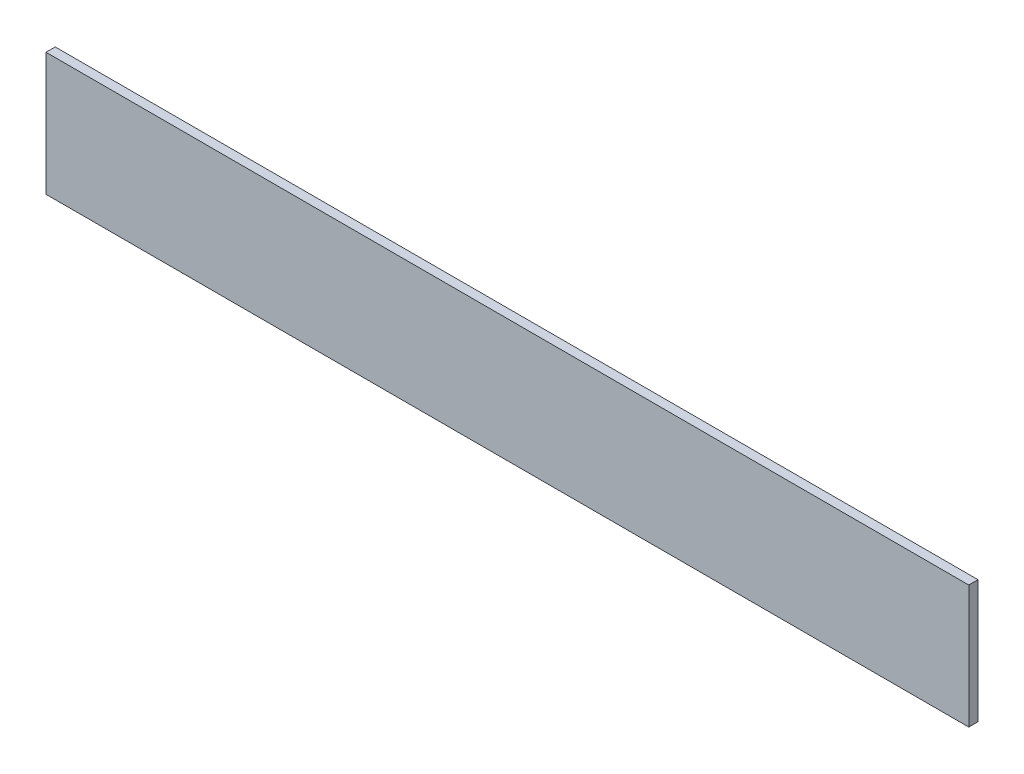
ISO-10303-21;
HEADER;
FILE_DESCRIPTION(('STEP AP214'),'2;1');
FILE_NAME('part.step','',(''),(''),'','','');
FILE_SCHEMA(('AUTOMOTIVE_DESIGN { 1 0 10303 214 1 1 1 1 }'));
ENDSEC;
DATA;
#1=APPLICATION_CONTEXT('core data for automotive mechanical design processes');
#2=APPLICATION_PROTOCOL_DEFINITION('international standard','automotive_design',2000,#1);
#3=PRODUCT_CONTEXT('',#1,'mechanical');
#4=PRODUCT('Part','Part','',(#3));
#5=PRODUCT_RELATED_PRODUCT_CATEGORY('part','',(#4));
#6=PRODUCT_DEFINITION_FORMATION('','',#4);
#7=PRODUCT_DEFINITION_CONTEXT('part definition',#1,'design');
#8=PRODUCT_DEFINITION('design','',#6,#7);
#9=PRODUCT_DEFINITION_SHAPE('','',#8);
#10=(LENGTH_UNIT() NAMED_UNIT(*) SI_UNIT(.MILLI.,.METRE.));
#11=(NAMED_UNIT(*) PLANE_ANGLE_UNIT() SI_UNIT($,.RADIAN.));
#12=(NAMED_UNIT(*) SI_UNIT($,.STERADIAN.) SOLID_ANGLE_UNIT());
#13=UNCERTAINTY_MEASURE_WITH_UNIT(LENGTH_MEASURE(1.E-05),#10,'distance_accuracy_value','');
#14=(GEOMETRIC_REPRESENTATION_CONTEXT(3) GLOBAL_UNCERTAINTY_ASSIGNED_CONTEXT((#13)) GLOBAL_UNIT_ASSIGNED_CONTEXT((#10,
#11,#12)) REPRESENTATION_CONTEXT('',''));
#15=CARTESIAN_POINT('',(0.,0.,0.));
#16=DIRECTION('',(0.,0.,1.));
#17=DIRECTION('',(1.,0.,0.));
#18=AXIS2_PLACEMENT_3D('',#15,#16,#17);
#19=CARTESIAN_POINT('',(0.,0.,2.99999999999989));
#20=DIRECTION('',(0.999999999999994,0.,0.));
#21=DIRECTION('',(0.,0.,-0.999999999999998));
#22=AXIS2_PLACEMENT_3D('',#19,#20,#21);
#23=PLANE('',#22);
#24=DIRECTION('',(0.,-1.,0.));
#25=VECTOR('',#24,1.);
#26=CARTESIAN_POINT('',(0.,0.,0.));
#27=LINE('',#26,#25);
#28=CARTESIAN_POINT('',(0.,40.0000000000016,-1.11022302462516E-12));
#29=VERTEX_POINT('',#28);
#30=CARTESIAN_POINT('',(0.,0.,0.));
#31=VERTEX_POINT('',#30);
#32=EDGE_CURVE('E100',#29,#31,#27,.T.);
#33=ORIENTED_EDGE('',*,*,#32,.T.);
#34=DIRECTION('',(0.,0.,-0.999999999999998));
#35=VECTOR('',#34,1.);
#36=CARTESIAN_POINT('',(0.,0.,2.99999999999989));
#37=LINE('',#36,#35);
#38=CARTESIAN_POINT('',(0.,0.,2.99999999999989));
#39=VERTEX_POINT('',#38);
#40=EDGE_CURVE('E11',#39,#31,#37,.T.);
#41=ORIENTED_EDGE('',*,*,#40,.F.);
#42=DIRECTION('',(0.,-1.,0.));
#43=VECTOR('',#42,1.);
#44=CARTESIAN_POINT('',(0.,0.,2.99999999999989));
#45=LINE('',#44,#43);
#46=CARTESIAN_POINT('',(0.,40.0000000000005,2.99999999999945));
#47=VERTEX_POINT('',#46);
#48=EDGE_CURVE('E88',#47,#39,#45,.T.);
#49=ORIENTED_EDGE('',*,*,#48,.F.);
#50=DIRECTION('',(0.,0.,-0.999999999999998));
#51=VECTOR('',#50,1.);
#52=CARTESIAN_POINT('',(0.,40.0000000000005,2.99999999999945));
#53=LINE('',#52,#51);
#54=EDGE_CURVE('E96',#47,#29,#53,.T.);
#55=ORIENTED_EDGE('',*,*,#54,.T.);
#56=EDGE_LOOP('',(#33,#41,#49,#55));
#57=FACE_BOUND('',#56,.T.);
#58=ADVANCED_FACE('F37',(#57),#23,.F.);
#59=CARTESIAN_POINT('',(0.,0.,2.99999999999989));
#60=DIRECTION('',(0.,1.,0.));
#61=DIRECTION('',(0.,0.,0.999999999999998));
#62=AXIS2_PLACEMENT_3D('',#59,#60,#61);
#63=PLANE('',#62);
#64=DIRECTION('',(0.999999999999994,0.,0.));
#65=VECTOR('',#64,1.);
#66=CARTESIAN_POINT('',(0.,0.,0.));
#67=LINE('',#66,#65);
#68=CARTESIAN_POINT('',(299.999999999998,8.88178419700125E-13,-6.66133814775094E-13));
#69=VERTEX_POINT('',#68);
#70=EDGE_CURVE('E92',#31,#69,#67,.T.);
#71=ORIENTED_EDGE('',*,*,#70,.T.);
#72=DIRECTION('',(0.,0.,-0.999999999999998));
#73=VECTOR('',#72,1.);
#74=CARTESIAN_POINT('',(299.999999999998,8.88178419700125E-13,2.99999999999967));
#75=LINE('',#74,#73);
#76=CARTESIAN_POINT('',(299.999999999998,8.88178419700125E-13,2.99999999999967));
#77=VERTEX_POINT('',#76);
#78=EDGE_CURVE('E45',#77,#69,#75,.T.);
#79=ORIENTED_EDGE('',*,*,#78,.F.);
#80=DIRECTION('',(0.999999999999994,0.,0.));
#81=VECTOR('',#80,1.);
#82=CARTESIAN_POINT('',(0.,0.,2.99999999999989));
#83=LINE('',#82,#81);
#84=EDGE_CURVE('E83',#39,#77,#83,.T.);
#85=ORIENTED_EDGE('',*,*,#84,.F.);
#86=ORIENTED_EDGE('',*,*,#40,.T.);
#87=EDGE_LOOP('',(#71,#79,#85,#86));
#88=FACE_BOUND('',#87,.T.);
#89=ADVANCED_FACE('F91',(#88),#63,.F.);
#90=CARTESIAN_POINT('',(299.999999999998,8.88178419700125E-13,2.99999999999967));
#91=DIRECTION('',(-0.999999999999994,0.,0.));
#92=DIRECTION('',(0.,0.,0.999999999999998));
#93=AXIS2_PLACEMENT_3D('',#90,#91,#92);
#94=PLANE('',#93);
#95=DIRECTION('',(0.,1.,0.));
#96=VECTOR('',#95,1.);
#97=CARTESIAN_POINT('',(299.999999999998,8.88178419700125E-13,-6.66133814775094E-13));
#98=LINE('',#97,#96);
#99=CARTESIAN_POINT('',(299.999999999998,40.0000000000009,2.22044604925031E-13));
#100=VERTEX_POINT('',#99);
#101=EDGE_CURVE('E70',#69,#100,#98,.T.);
#102=ORIENTED_EDGE('',*,*,#101,.T.);
#103=DIRECTION('',(0.,0.,-0.999999999999998));
#104=VECTOR('',#103,1.);
#105=CARTESIAN_POINT('',(299.999999999998,40.0000000000009,2.99999999999945));
#106=LINE('',#105,#104);
#107=CARTESIAN_POINT('',(299.999999999998,40.0000000000009,2.99999999999945));
#108=VERTEX_POINT('',#107);
#109=EDGE_CURVE('E93',#108,#100,#106,.T.);
#110=ORIENTED_EDGE('',*,*,#109,.F.);
#111=DIRECTION('',(0.,1.,0.));
#112=VECTOR('',#111,1.);
#113=CARTESIAN_POINT('',(299.999999999998,8.88178419700125E-13,2.99999999999967));
#114=LINE('',#113,#112);
#115=EDGE_CURVE('E86',#77,#108,#114,.T.);
#116=ORIENTED_EDGE('',*,*,#115,.F.);
#117=ORIENTED_EDGE('',*,*,#78,.T.);
#118=EDGE_LOOP('',(#102,#110,#116,#117));
#119=FACE_BOUND('',#118,.T.);
#120=ADVANCED_FACE('F94',(#119),#94,.F.);
#121=CARTESIAN_POINT('',(0.,40.0000000000005,2.99999999999945));
#122=DIRECTION('',(0.,-1.,0.));
#123=DIRECTION('',(0.,0.,-0.999999999999998));
#124=AXIS2_PLACEMENT_3D('',#121,#122,#123);
#125=PLANE('',#124);
#126=DIRECTION('',(-0.999999999999994,0.,0.));
#127=VECTOR('',#126,1.);
#128=CARTESIAN_POINT('',(0.,40.0000000000016,-1.11022302462516E-12));
#129=LINE('',#128,#127);
#130=EDGE_CURVE('E76',#100,#29,#129,.T.);
#131=ORIENTED_EDGE('',*,*,#130,.T.);
#132=ORIENTED_EDGE('',*,*,#54,.F.);
#133=DIRECTION('',(-0.999999999999994,0.,0.));
#134=VECTOR('',#133,1.);
#135=CARTESIAN_POINT('',(0.,40.0000000000005,2.99999999999945));
#136=LINE('',#135,#134);
#137=EDGE_CURVE('E53',#108,#47,#136,.T.);
#138=ORIENTED_EDGE('',*,*,#137,.F.);
#139=ORIENTED_EDGE('',*,*,#109,.T.);
#140=EDGE_LOOP('',(#131,#132,#138,#139));
#141=FACE_BOUND('',#140,.T.);
#142=ADVANCED_FACE('F107',(#141),#125,.F.);
#143=CARTESIAN_POINT('',(0.,0.,2.99999999999989));
#144=DIRECTION('',(0.,0.,-0.999999999999998));
#145=DIRECTION('',(-0.999999999999994,0.,0.));
#146=AXIS2_PLACEMENT_3D('',#143,#144,#145);
#147=PLANE('',#146);
#148=ORIENTED_EDGE('',*,*,#48,.T.);
#149=ORIENTED_EDGE('',*,*,#84,.T.);
#150=ORIENTED_EDGE('',*,*,#115,.T.);
#151=ORIENTED_EDGE('',*,*,#137,.T.);
#152=EDGE_LOOP('',(#148,#149,#150,#151));
#153=FACE_BOUND('',#152,.T.);
#154=ADVANCED_FACE('F84',(#153),#147,.F.);
#155=CARTESIAN_POINT('',(0.,0.,0.));
#156=DIRECTION('',(0.,0.,-0.999999999999998));
#157=DIRECTION('',(-0.999999999999994,0.,0.));
#158=AXIS2_PLACEMENT_3D('',#155,#156,#157);
#159=PLANE('',#158);
#160=ORIENTED_EDGE('',*,*,#32,.F.);
#161=ORIENTED_EDGE('',*,*,#130,.F.);
#162=ORIENTED_EDGE('',*,*,#101,.F.);
#163=ORIENTED_EDGE('',*,*,#70,.F.);
#164=EDGE_LOOP('',(#160,#161,#162,#163));
#165=FACE_BOUND('',#164,.T.);
#166=ADVANCED_FACE('F110',(#165),#159,.T.);
#167=CLOSED_SHELL('',(#58,#89,#120,#142,#154,#166));
#168=MANIFOLD_SOLID_BREP('B2',#167);
#169=ADVANCED_BREP_SHAPE_REPRESENTATION('',(#18,#168),#14);
#170=SHAPE_DEFINITION_REPRESENTATION(#9,#169);
ENDSEC;
END-ISO-10303-21;
